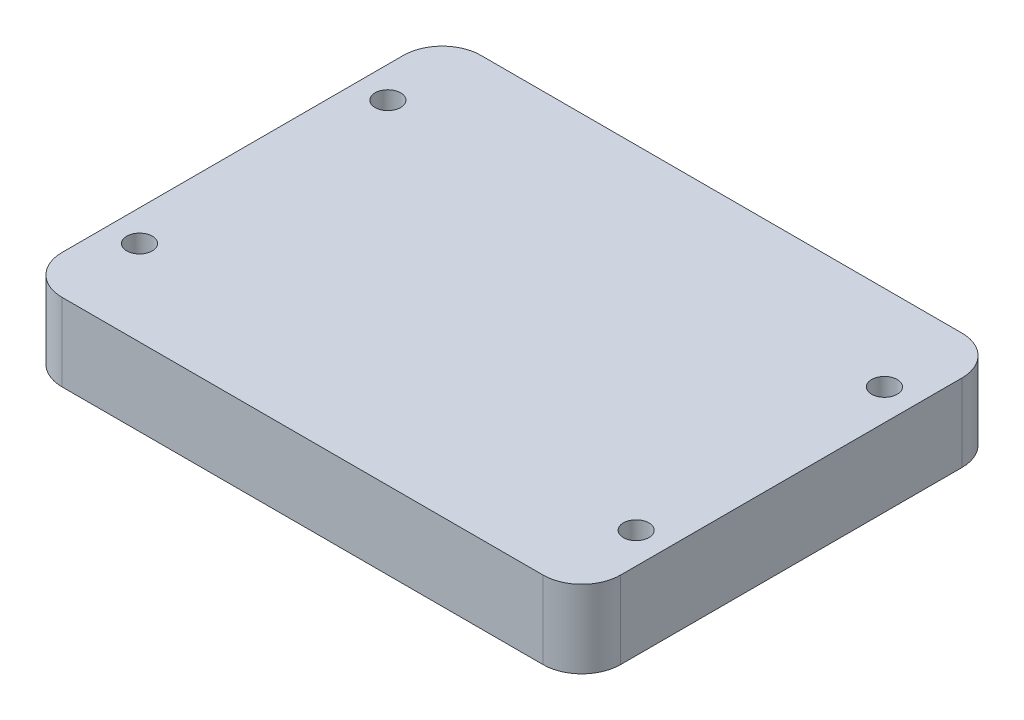
ISO-10303-21;
HEADER;
FILE_DESCRIPTION(('STEP AP214'),'2;1');
FILE_NAME('part.step','',(''),(''),'','','');
FILE_SCHEMA(('AUTOMOTIVE_DESIGN { 1 0 10303 214 1 1 1 1 }'));
ENDSEC;
DATA;
#1=APPLICATION_CONTEXT('core data for automotive mechanical design processes');
#2=APPLICATION_PROTOCOL_DEFINITION('international standard','automotive_design',2000,#1);
#3=PRODUCT_CONTEXT('',#1,'mechanical');
#4=PRODUCT('Part','Part','',(#3));
#5=PRODUCT_RELATED_PRODUCT_CATEGORY('part','',(#4));
#6=PRODUCT_DEFINITION_FORMATION('','',#4);
#7=PRODUCT_DEFINITION_CONTEXT('part definition',#1,'design');
#8=PRODUCT_DEFINITION('design','',#6,#7);
#9=PRODUCT_DEFINITION_SHAPE('','',#8);
#10=(LENGTH_UNIT() NAMED_UNIT(*) SI_UNIT(.MILLI.,.METRE.));
#11=(NAMED_UNIT(*) PLANE_ANGLE_UNIT() SI_UNIT($,.RADIAN.));
#12=(NAMED_UNIT(*) SI_UNIT($,.STERADIAN.) SOLID_ANGLE_UNIT());
#13=UNCERTAINTY_MEASURE_WITH_UNIT(LENGTH_MEASURE(1.E-05),#10,'distance_accuracy_value','');
#14=(GEOMETRIC_REPRESENTATION_CONTEXT(3) GLOBAL_UNCERTAINTY_ASSIGNED_CONTEXT((#13)) GLOBAL_UNIT_ASSIGNED_CONTEXT((#10,
#11,#12)) REPRESENTATION_CONTEXT('',''));
#15=CARTESIAN_POINT('',(0.,0.,0.));
#16=DIRECTION('',(0.,0.,1.));
#17=DIRECTION('',(1.,0.,0.));
#18=AXIS2_PLACEMENT_3D('',#15,#16,#17);
#19=CARTESIAN_POINT('',(36.,10.,-27.));
#20=DIRECTION('',(-1.,0.,0.));
#21=DIRECTION('',(0.,0.,1.));
#22=AXIS2_PLACEMENT_3D('',#19,#20,#21);
#23=PLANE('',#22);
#24=DIRECTION('',(0.,0.,-1.));
#25=VECTOR('',#24,1.);
#26=CARTESIAN_POINT('',(36.,0.,-27.));
#27=LINE('',#26,#25);
#28=CARTESIAN_POINT('',(36.,0.,22.));
#29=VERTEX_POINT('',#28);
#30=CARTESIAN_POINT('',(36.,0.,-22.));
#31=VERTEX_POINT('',#30);
#32=EDGE_CURVE('E125',#29,#31,#27,.T.);
#33=ORIENTED_EDGE('',*,*,#32,.T.);
#34=DIRECTION('',(0.,-1.,0.));
#35=VECTOR('',#34,1.);
#36=CARTESIAN_POINT('',(36.,10.,-22.));
#37=LINE('',#36,#35);
#38=CARTESIAN_POINT('',(36.,10.,-22.));
#39=VERTEX_POINT('',#38);
#40=EDGE_CURVE('E103',#31,#39,#37,.F.);
#41=ORIENTED_EDGE('',*,*,#40,.T.);
#42=DIRECTION('',(0.,0.,-1.));
#43=VECTOR('',#42,1.);
#44=CARTESIAN_POINT('',(36.,10.,-27.));
#45=LINE('',#44,#43);
#46=CARTESIAN_POINT('',(36.,10.,22.));
#47=VERTEX_POINT('',#46);
#48=EDGE_CURVE('E135',#47,#39,#45,.T.);
#49=ORIENTED_EDGE('',*,*,#48,.F.);
#50=DIRECTION('',(0.,-1.,0.));
#51=VECTOR('',#50,1.);
#52=CARTESIAN_POINT('',(36.,10.,22.));
#53=LINE('',#52,#51);
#54=EDGE_CURVE('E108',#47,#29,#53,.T.);
#55=ORIENTED_EDGE('',*,*,#54,.T.);
#56=EDGE_LOOP('',(#33,#41,#49,#55));
#57=FACE_BOUND('',#56,.T.);
#58=ADVANCED_FACE('F32',(#57),#23,.F.);
#59=CARTESIAN_POINT('',(-36.,10.,-27.));
#60=DIRECTION('',(0.,0.,1.));
#61=DIRECTION('',(1.,0.,0.));
#62=AXIS2_PLACEMENT_3D('',#59,#60,#61);
#63=PLANE('',#62);
#64=DIRECTION('',(-1.,0.,0.));
#65=VECTOR('',#64,1.);
#66=CARTESIAN_POINT('',(-36.,10.,-27.));
#67=LINE('',#66,#65);
#68=CARTESIAN_POINT('',(31.,10.,-27.));
#69=VERTEX_POINT('',#68);
#70=CARTESIAN_POINT('',(-31.,10.,-27.));
#71=VERTEX_POINT('',#70);
#72=EDGE_CURVE('E118',#69,#71,#67,.T.);
#73=ORIENTED_EDGE('',*,*,#72,.F.);
#74=DIRECTION('',(0.,-1.,0.));
#75=VECTOR('',#74,1.);
#76=CARTESIAN_POINT('',(31.,10.,-27.));
#77=LINE('',#76,#75);
#78=CARTESIAN_POINT('',(31.,0.,-27.));
#79=VERTEX_POINT('',#78);
#80=EDGE_CURVE('E102',#69,#79,#77,.T.);
#81=ORIENTED_EDGE('',*,*,#80,.T.);
#82=DIRECTION('',(-1.,0.,0.));
#83=VECTOR('',#82,1.);
#84=CARTESIAN_POINT('',(-36.,0.,-27.));
#85=LINE('',#84,#83);
#86=CARTESIAN_POINT('',(-31.,0.,-27.));
#87=VERTEX_POINT('',#86);
#88=EDGE_CURVE('E115',#79,#87,#85,.T.);
#89=ORIENTED_EDGE('',*,*,#88,.T.);
#90=DIRECTION('',(0.,-1.,0.));
#91=VECTOR('',#90,1.);
#92=CARTESIAN_POINT('',(-31.,10.,-27.));
#93=LINE('',#92,#91);
#94=EDGE_CURVE('E120',#87,#71,#93,.F.);
#95=ORIENTED_EDGE('',*,*,#94,.T.);
#96=EDGE_LOOP('',(#73,#81,#89,#95));
#97=FACE_BOUND('',#96,.T.);
#98=ADVANCED_FACE('F114',(#97),#63,.F.);
#99=CARTESIAN_POINT('',(-36.,10.,-27.));
#100=DIRECTION('',(1.,0.,0.));
#101=DIRECTION('',(0.,0.,-1.));
#102=AXIS2_PLACEMENT_3D('',#99,#100,#101);
#103=PLANE('',#102);
#104=DIRECTION('',(0.,0.,1.));
#105=VECTOR('',#104,1.);
#106=CARTESIAN_POINT('',(-36.,10.,-27.));
#107=LINE('',#106,#105);
#108=CARTESIAN_POINT('',(-36.,10.,-22.));
#109=VERTEX_POINT('',#108);
#110=CARTESIAN_POINT('',(-36.,10.,22.));
#111=VERTEX_POINT('',#110);
#112=EDGE_CURVE('E161',#109,#111,#107,.T.);
#113=ORIENTED_EDGE('',*,*,#112,.F.);
#114=DIRECTION('',(0.,-1.,0.));
#115=VECTOR('',#114,1.);
#116=CARTESIAN_POINT('',(-36.,10.,-22.));
#117=LINE('',#116,#115);
#118=CARTESIAN_POINT('',(-36.,0.,-22.));
#119=VERTEX_POINT('',#118);
#120=EDGE_CURVE('E154',#109,#119,#117,.T.);
#121=ORIENTED_EDGE('',*,*,#120,.T.);
#122=DIRECTION('',(0.,0.,1.));
#123=VECTOR('',#122,1.);
#124=CARTESIAN_POINT('',(-36.,0.,-27.));
#125=LINE('',#124,#123);
#126=CARTESIAN_POINT('',(-36.,0.,22.));
#127=VERTEX_POINT('',#126);
#128=EDGE_CURVE('E124',#119,#127,#125,.T.);
#129=ORIENTED_EDGE('',*,*,#128,.T.);
#130=DIRECTION('',(0.,-1.,0.));
#131=VECTOR('',#130,1.);
#132=CARTESIAN_POINT('',(-36.,10.,22.));
#133=LINE('',#132,#131);
#134=EDGE_CURVE('E152',#127,#111,#133,.F.);
#135=ORIENTED_EDGE('',*,*,#134,.T.);
#136=EDGE_LOOP('',(#113,#121,#129,#135));
#137=FACE_BOUND('',#136,.T.);
#138=ADVANCED_FACE('F159',(#137),#103,.F.);
#139=CARTESIAN_POINT('',(-36.,10.,27.));
#140=DIRECTION('',(0.,0.,-1.));
#141=DIRECTION('',(-1.,0.,0.));
#142=AXIS2_PLACEMENT_3D('',#139,#140,#141);
#143=PLANE('',#142);
#144=DIRECTION('',(1.,0.,0.));
#145=VECTOR('',#144,1.);
#146=CARTESIAN_POINT('',(-36.,10.,27.));
#147=LINE('',#146,#145);
#148=CARTESIAN_POINT('',(-31.,10.,27.));
#149=VERTEX_POINT('',#148);
#150=CARTESIAN_POINT('',(31.,10.,27.));
#151=VERTEX_POINT('',#150);
#152=EDGE_CURVE('E136',#149,#151,#147,.T.);
#153=ORIENTED_EDGE('',*,*,#152,.F.);
#154=DIRECTION('',(0.,-1.,0.));
#155=VECTOR('',#154,1.);
#156=CARTESIAN_POINT('',(-31.,10.,27.));
#157=LINE('',#156,#155);
#158=CARTESIAN_POINT('',(-31.,0.,27.));
#159=VERTEX_POINT('',#158);
#160=EDGE_CURVE('E11',#149,#159,#157,.T.);
#161=ORIENTED_EDGE('',*,*,#160,.T.);
#162=DIRECTION('',(1.,0.,0.));
#163=VECTOR('',#162,1.);
#164=CARTESIAN_POINT('',(-36.,0.,27.));
#165=LINE('',#164,#163);
#166=CARTESIAN_POINT('',(31.,0.,27.));
#167=VERTEX_POINT('',#166);
#168=EDGE_CURVE('E128',#159,#167,#165,.T.);
#169=ORIENTED_EDGE('',*,*,#168,.T.);
#170=DIRECTION('',(0.,-1.,0.));
#171=VECTOR('',#170,1.);
#172=CARTESIAN_POINT('',(31.,10.,27.));
#173=LINE('',#172,#171);
#174=EDGE_CURVE('E40',#167,#151,#173,.F.);
#175=ORIENTED_EDGE('',*,*,#174,.T.);
#176=EDGE_LOOP('',(#153,#161,#169,#175));
#177=FACE_BOUND('',#176,.T.);
#178=ADVANCED_FACE('F168',(#177),#143,.F.);
#179=CARTESIAN_POINT('',(0.,10.,0.));
#180=DIRECTION('',(0.,1.,0.));
#181=DIRECTION('',(0.,0.,1.));
#182=AXIS2_PLACEMENT_3D('',#179,#180,#181);
#183=PLANE('',#182);
#184=CARTESIAN_POINT('',(-32.,10.,16.));
#185=DIRECTION('',(0.,1.,0.));
#186=DIRECTION('',(0.,0.,1.));
#187=AXIS2_PLACEMENT_3D('',#184,#185,#186);
#188=CIRCLE('',#187,1.65);
#189=CARTESIAN_POINT('',(-32.,10.,17.65));
#190=VERTEX_POINT('',#189);
#191=EDGE_CURVE('E130',#190,#190,#188,.T.);
#192=ORIENTED_EDGE('',*,*,#191,.F.);
#193=EDGE_LOOP('',(#192));
#194=FACE_BOUND('',#193,.T.);
#195=CARTESIAN_POINT('',(32.,10.,16.));
#196=DIRECTION('',(0.,1.,0.));
#197=DIRECTION('',(0.,0.,1.));
#198=AXIS2_PLACEMENT_3D('',#195,#196,#197);
#199=CIRCLE('',#198,1.65);
#200=CARTESIAN_POINT('',(32.,10.,17.65));
#201=VERTEX_POINT('',#200);
#202=EDGE_CURVE('E177',#201,#201,#199,.T.);
#203=ORIENTED_EDGE('',*,*,#202,.F.);
#204=EDGE_LOOP('',(#203));
#205=FACE_BOUND('',#204,.T.);
#206=CARTESIAN_POINT('',(32.,10.,-16.));
#207=DIRECTION('',(0.,1.,0.));
#208=DIRECTION('',(0.,0.,1.));
#209=AXIS2_PLACEMENT_3D('',#206,#207,#208);
#210=CIRCLE('',#209,1.65);
#211=CARTESIAN_POINT('',(32.,10.,-14.35));
#212=VERTEX_POINT('',#211);
#213=EDGE_CURVE('E180',#212,#212,#210,.T.);
#214=ORIENTED_EDGE('',*,*,#213,.F.);
#215=EDGE_LOOP('',(#214));
#216=FACE_BOUND('',#215,.T.);
#217=CARTESIAN_POINT('',(-32.,10.,-16.));
#218=DIRECTION('',(0.,1.,0.));
#219=DIRECTION('',(0.,0.,1.));
#220=AXIS2_PLACEMENT_3D('',#217,#218,#219);
#221=CIRCLE('',#220,1.65);
#222=CARTESIAN_POINT('',(-32.,10.,-14.35));
#223=VERTEX_POINT('',#222);
#224=EDGE_CURVE('E183',#223,#223,#221,.T.);
#225=ORIENTED_EDGE('',*,*,#224,.F.);
#226=EDGE_LOOP('',(#225));
#227=FACE_BOUND('',#226,.T.);
#228=ORIENTED_EDGE('',*,*,#48,.T.);
#229=CARTESIAN_POINT('',(31.,10.,-22.));
#230=DIRECTION('',(0.,1.,0.));
#231=DIRECTION('',(0.,0.,1.));
#232=AXIS2_PLACEMENT_3D('',#229,#230,#231);
#233=CIRCLE('',#232,5.);
#234=EDGE_CURVE('E150',#39,#69,#233,.T.);
#235=ORIENTED_EDGE('',*,*,#234,.T.);
#236=ORIENTED_EDGE('',*,*,#72,.T.);
#237=CARTESIAN_POINT('',(-31.,10.,-22.));
#238=DIRECTION('',(0.,1.,0.));
#239=DIRECTION('',(0.,0.,1.));
#240=AXIS2_PLACEMENT_3D('',#237,#238,#239);
#241=CIRCLE('',#240,5.);
#242=EDGE_CURVE('E148',#71,#109,#241,.T.);
#243=ORIENTED_EDGE('',*,*,#242,.T.);
#244=ORIENTED_EDGE('',*,*,#112,.T.);
#245=CARTESIAN_POINT('',(-31.,10.,22.));
#246=DIRECTION('',(0.,1.,0.));
#247=DIRECTION('',(0.,0.,1.));
#248=AXIS2_PLACEMENT_3D('',#245,#246,#247);
#249=CIRCLE('',#248,5.);
#250=EDGE_CURVE('E53',#111,#149,#249,.T.);
#251=ORIENTED_EDGE('',*,*,#250,.T.);
#252=ORIENTED_EDGE('',*,*,#152,.T.);
#253=CARTESIAN_POINT('',(31.,10.,22.));
#254=DIRECTION('',(0.,1.,0.));
#255=DIRECTION('',(0.,0.,1.));
#256=AXIS2_PLACEMENT_3D('',#253,#254,#255);
#257=CIRCLE('',#256,5.);
#258=EDGE_CURVE('E145',#151,#47,#257,.T.);
#259=ORIENTED_EDGE('',*,*,#258,.T.);
#260=EDGE_LOOP('',(#228,#235,#236,#243,#244,#251,#252,#259));
#261=FACE_BOUND('',#260,.T.);
#262=ADVANCED_FACE('F238',(#194,#205,#216,#227,#261),#183,.T.);
#263=CARTESIAN_POINT('',(0.,0.,0.));
#264=DIRECTION('',(0.,1.,0.));
#265=DIRECTION('',(0.,0.,1.));
#266=AXIS2_PLACEMENT_3D('',#263,#264,#265);
#267=PLANE('',#266);
#268=CARTESIAN_POINT('',(-32.,0.,16.));
#269=DIRECTION('',(0.,1.,0.));
#270=DIRECTION('',(0.,0.,1.));
#271=AXIS2_PLACEMENT_3D('',#268,#269,#270);
#272=CIRCLE('',#271,1.65);
#273=CARTESIAN_POINT('',(-32.,0.,17.65));
#274=VERTEX_POINT('',#273);
#275=EDGE_CURVE('E190',#274,#274,#272,.T.);
#276=ORIENTED_EDGE('',*,*,#275,.T.);
#277=EDGE_LOOP('',(#276));
#278=FACE_BOUND('',#277,.T.);
#279=CARTESIAN_POINT('',(32.,0.,16.));
#280=DIRECTION('',(0.,1.,0.));
#281=DIRECTION('',(0.,0.,1.));
#282=AXIS2_PLACEMENT_3D('',#279,#280,#281);
#283=CIRCLE('',#282,1.65);
#284=CARTESIAN_POINT('',(32.,0.,17.65));
#285=VERTEX_POINT('',#284);
#286=EDGE_CURVE('E193',#285,#285,#283,.T.);
#287=ORIENTED_EDGE('',*,*,#286,.T.);
#288=EDGE_LOOP('',(#287));
#289=FACE_BOUND('',#288,.T.);
#290=CARTESIAN_POINT('',(32.,0.,-16.));
#291=DIRECTION('',(0.,1.,0.));
#292=DIRECTION('',(0.,0.,1.));
#293=AXIS2_PLACEMENT_3D('',#290,#291,#292);
#294=CIRCLE('',#293,1.65);
#295=CARTESIAN_POINT('',(32.,0.,-14.35));
#296=VERTEX_POINT('',#295);
#297=EDGE_CURVE('E189',#296,#296,#294,.T.);
#298=ORIENTED_EDGE('',*,*,#297,.T.);
#299=EDGE_LOOP('',(#298));
#300=FACE_BOUND('',#299,.T.);
#301=CARTESIAN_POINT('',(-32.,0.,-16.));
#302=DIRECTION('',(0.,1.,0.));
#303=DIRECTION('',(0.,0.,1.));
#304=AXIS2_PLACEMENT_3D('',#301,#302,#303);
#305=CIRCLE('',#304,1.65);
#306=CARTESIAN_POINT('',(-32.,0.,-14.35));
#307=VERTEX_POINT('',#306);
#308=EDGE_CURVE('E186',#307,#307,#305,.T.);
#309=ORIENTED_EDGE('',*,*,#308,.T.);
#310=EDGE_LOOP('',(#309));
#311=FACE_BOUND('',#310,.T.);
#312=ORIENTED_EDGE('',*,*,#88,.F.);
#313=CARTESIAN_POINT('',(31.,0.,-22.));
#314=DIRECTION('',(0.,1.,0.));
#315=DIRECTION('',(0.,0.,1.));
#316=AXIS2_PLACEMENT_3D('',#313,#314,#315);
#317=CIRCLE('',#316,5.);
#318=EDGE_CURVE('E98',#79,#31,#317,.F.);
#319=ORIENTED_EDGE('',*,*,#318,.T.);
#320=ORIENTED_EDGE('',*,*,#32,.F.);
#321=CARTESIAN_POINT('',(31.,0.,22.));
#322=DIRECTION('',(0.,1.,0.));
#323=DIRECTION('',(0.,0.,1.));
#324=AXIS2_PLACEMENT_3D('',#321,#322,#323);
#325=CIRCLE('',#324,5.);
#326=EDGE_CURVE('E119',#29,#167,#325,.F.);
#327=ORIENTED_EDGE('',*,*,#326,.T.);
#328=ORIENTED_EDGE('',*,*,#168,.F.);
#329=CARTESIAN_POINT('',(-31.,0.,22.));
#330=DIRECTION('',(0.,1.,0.));
#331=DIRECTION('',(0.,0.,1.));
#332=AXIS2_PLACEMENT_3D('',#329,#330,#331);
#333=CIRCLE('',#332,5.);
#334=EDGE_CURVE('E139',#159,#127,#333,.F.);
#335=ORIENTED_EDGE('',*,*,#334,.T.);
#336=ORIENTED_EDGE('',*,*,#128,.F.);
#337=CARTESIAN_POINT('',(-31.,0.,-22.));
#338=DIRECTION('',(0.,1.,0.));
#339=DIRECTION('',(0.,0.,1.));
#340=AXIS2_PLACEMENT_3D('',#337,#338,#339);
#341=CIRCLE('',#340,5.);
#342=EDGE_CURVE('E109',#119,#87,#341,.F.);
#343=ORIENTED_EDGE('',*,*,#342,.T.);
#344=EDGE_LOOP('',(#312,#319,#320,#327,#328,#335,#336,#343));
#345=FACE_BOUND('',#344,.T.);
#346=ADVANCED_FACE('F122',(#278,#289,#300,#311,#345),#267,.F.);
#347=CARTESIAN_POINT('',(-32.,0.,-16.));
#348=DIRECTION('',(0.,1.,0.));
#349=DIRECTION('',(0.,0.,1.));
#350=AXIS2_PLACEMENT_3D('',#347,#348,#349);
#351=CYLINDRICAL_SURFACE('',#350,1.65);
#352=ORIENTED_EDGE('',*,*,#224,.T.);
#353=EDGE_LOOP('',(#352));
#354=FACE_BOUND('',#353,.T.);
#355=ORIENTED_EDGE('',*,*,#308,.F.);
#356=EDGE_LOOP('',(#355));
#357=FACE_BOUND('',#356,.T.);
#358=ADVANCED_FACE('F204',(#354,#357),#351,.F.);
#359=CARTESIAN_POINT('',(32.,0.,-16.));
#360=DIRECTION('',(0.,1.,0.));
#361=DIRECTION('',(0.,0.,1.));
#362=AXIS2_PLACEMENT_3D('',#359,#360,#361);
#363=CYLINDRICAL_SURFACE('',#362,1.65);
#364=ORIENTED_EDGE('',*,*,#213,.T.);
#365=EDGE_LOOP('',(#364));
#366=FACE_BOUND('',#365,.T.);
#367=ORIENTED_EDGE('',*,*,#297,.F.);
#368=EDGE_LOOP('',(#367));
#369=FACE_BOUND('',#368,.T.);
#370=ADVANCED_FACE('F201',(#366,#369),#363,.F.);
#371=CARTESIAN_POINT('',(32.,0.,16.));
#372=DIRECTION('',(0.,1.,0.));
#373=DIRECTION('',(0.,0.,1.));
#374=AXIS2_PLACEMENT_3D('',#371,#372,#373);
#375=CYLINDRICAL_SURFACE('',#374,1.65);
#376=ORIENTED_EDGE('',*,*,#202,.T.);
#377=EDGE_LOOP('',(#376));
#378=FACE_BOUND('',#377,.T.);
#379=ORIENTED_EDGE('',*,*,#286,.F.);
#380=EDGE_LOOP('',(#379));
#381=FACE_BOUND('',#380,.T.);
#382=ADVANCED_FACE('F203',(#378,#381),#375,.F.);
#383=CARTESIAN_POINT('',(-32.,0.,16.));
#384=DIRECTION('',(0.,1.,0.));
#385=DIRECTION('',(0.,0.,1.));
#386=AXIS2_PLACEMENT_3D('',#383,#384,#385);
#387=CYLINDRICAL_SURFACE('',#386,1.65);
#388=ORIENTED_EDGE('',*,*,#191,.T.);
#389=EDGE_LOOP('',(#388));
#390=FACE_BOUND('',#389,.T.);
#391=ORIENTED_EDGE('',*,*,#275,.F.);
#392=EDGE_LOOP('',(#391));
#393=FACE_BOUND('',#392,.T.);
#394=ADVANCED_FACE('F211',(#390,#393),#387,.F.);
#395=CARTESIAN_POINT('',(31.,10.,-22.));
#396=DIRECTION('',(0.,-1.,0.));
#397=DIRECTION('',(0.,0.,-1.));
#398=AXIS2_PLACEMENT_3D('',#395,#396,#397);
#399=CYLINDRICAL_SURFACE('',#398,5.);
#400=ORIENTED_EDGE('',*,*,#234,.F.);
#401=ORIENTED_EDGE('',*,*,#40,.F.);
#402=ORIENTED_EDGE('',*,*,#318,.F.);
#403=ORIENTED_EDGE('',*,*,#80,.F.);
#404=EDGE_LOOP('',(#400,#401,#402,#403));
#405=FACE_BOUND('',#404,.T.);
#406=ADVANCED_FACE('F101',(#405),#399,.T.);
#407=CARTESIAN_POINT('',(-31.,10.,-22.));
#408=DIRECTION('',(0.,-1.,0.));
#409=DIRECTION('',(0.,0.,-1.));
#410=AXIS2_PLACEMENT_3D('',#407,#408,#409);
#411=CYLINDRICAL_SURFACE('',#410,5.);
#412=ORIENTED_EDGE('',*,*,#242,.F.);
#413=ORIENTED_EDGE('',*,*,#94,.F.);
#414=ORIENTED_EDGE('',*,*,#342,.F.);
#415=ORIENTED_EDGE('',*,*,#120,.F.);
#416=EDGE_LOOP('',(#412,#413,#414,#415));
#417=FACE_BOUND('',#416,.T.);
#418=ADVANCED_FACE('F227',(#417),#411,.T.);
#419=CARTESIAN_POINT('',(-31.,10.,22.));
#420=DIRECTION('',(0.,-1.,0.));
#421=DIRECTION('',(0.,0.,-1.));
#422=AXIS2_PLACEMENT_3D('',#419,#420,#421);
#423=CYLINDRICAL_SURFACE('',#422,5.);
#424=ORIENTED_EDGE('',*,*,#250,.F.);
#425=ORIENTED_EDGE('',*,*,#134,.F.);
#426=ORIENTED_EDGE('',*,*,#334,.F.);
#427=ORIENTED_EDGE('',*,*,#160,.F.);
#428=EDGE_LOOP('',(#424,#425,#426,#427));
#429=FACE_BOUND('',#428,.T.);
#430=ADVANCED_FACE('F167',(#429),#423,.T.);
#431=CARTESIAN_POINT('',(31.,10.,22.));
#432=DIRECTION('',(0.,-1.,0.));
#433=DIRECTION('',(0.,0.,-1.));
#434=AXIS2_PLACEMENT_3D('',#431,#432,#433);
#435=CYLINDRICAL_SURFACE('',#434,5.);
#436=ORIENTED_EDGE('',*,*,#258,.F.);
#437=ORIENTED_EDGE('',*,*,#174,.F.);
#438=ORIENTED_EDGE('',*,*,#326,.F.);
#439=ORIENTED_EDGE('',*,*,#54,.F.);
#440=EDGE_LOOP('',(#436,#437,#438,#439));
#441=FACE_BOUND('',#440,.T.);
#442=ADVANCED_FACE('F34',(#441),#435,.T.);
#443=CLOSED_SHELL('',(#58,#98,#138,#178,#262,#346,#358,#370,#382,#394,#406,#418,#430,#442));
#444=MANIFOLD_SOLID_BREP('B2',#443);
#445=ADVANCED_BREP_SHAPE_REPRESENTATION('',(#18,#444),#14);
#446=SHAPE_DEFINITION_REPRESENTATION(#9,#445);
ENDSEC;
END-ISO-10303-21;
